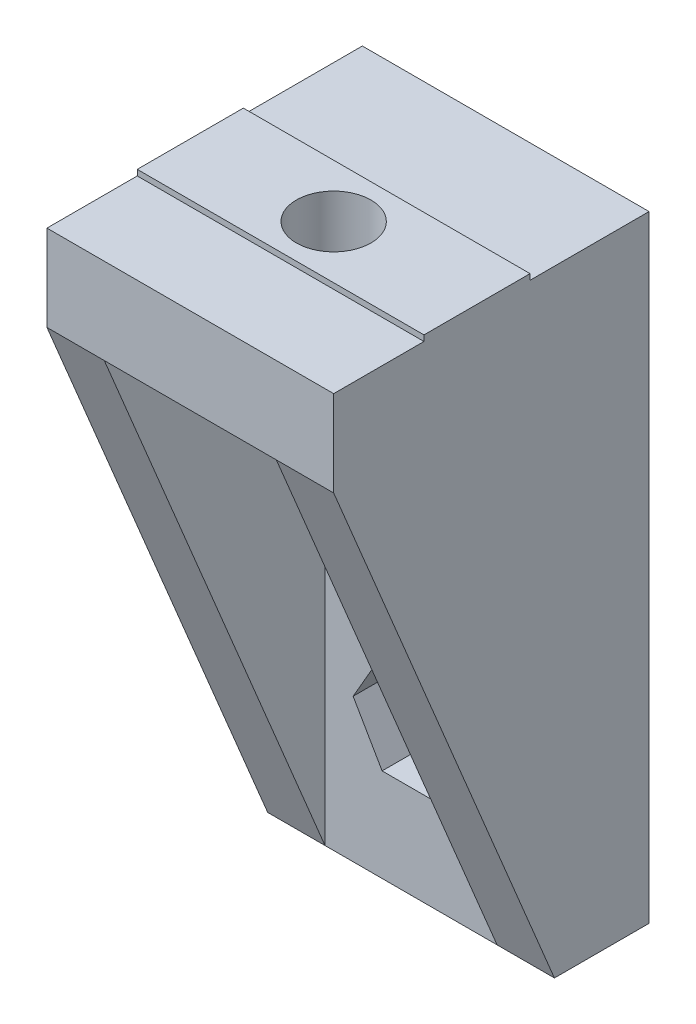
ISO-10303-21;
HEADER;
FILE_DESCRIPTION(('STEP AP214'),'2;1');
FILE_NAME('part.step','',(''),(''),'','','');
FILE_SCHEMA(('AUTOMOTIVE_DESIGN { 1 0 10303 214 1 1 1 1 }'));
ENDSEC;
DATA;
#1=APPLICATION_CONTEXT('core data for automotive mechanical design processes');
#2=APPLICATION_PROTOCOL_DEFINITION('international standard','automotive_design',2000,#1);
#3=PRODUCT_CONTEXT('',#1,'mechanical');
#4=PRODUCT('Part','Part','',(#3));
#5=PRODUCT_RELATED_PRODUCT_CATEGORY('part','',(#4));
#6=PRODUCT_DEFINITION_FORMATION('','',#4);
#7=PRODUCT_DEFINITION_CONTEXT('part definition',#1,'design');
#8=PRODUCT_DEFINITION('design','',#6,#7);
#9=PRODUCT_DEFINITION_SHAPE('','',#8);
#10=(LENGTH_UNIT() NAMED_UNIT(*) SI_UNIT(.MILLI.,.METRE.));
#11=(NAMED_UNIT(*) PLANE_ANGLE_UNIT() SI_UNIT($,.RADIAN.));
#12=(NAMED_UNIT(*) SI_UNIT($,.STERADIAN.) SOLID_ANGLE_UNIT());
#13=UNCERTAINTY_MEASURE_WITH_UNIT(LENGTH_MEASURE(1.E-05),#10,'distance_accuracy_value','');
#14=(GEOMETRIC_REPRESENTATION_CONTEXT(3) GLOBAL_UNCERTAINTY_ASSIGNED_CONTEXT((#13)) GLOBAL_UNIT_ASSIGNED_CONTEXT((#10,
#11,#12)) REPRESENTATION_CONTEXT('',''));
#15=CARTESIAN_POINT('',(0.,0.,0.));
#16=DIRECTION('',(0.,0.,1.));
#17=DIRECTION('',(1.,0.,0.));
#18=AXIS2_PLACEMENT_3D('',#15,#16,#17);
#19=CARTESIAN_POINT('',(0.,0.,6.6));
#20=DIRECTION('',(0.,0.,1.));
#21=DIRECTION('',(1.,0.,0.));
#22=AXIS2_PLACEMENT_3D('',#19,#20,#21);
#23=PLANE('',#22);
#24=DIRECTION('',(0.5,0.866025403784439,0.));
#25=VECTOR('',#24,1.);
#26=CARTESIAN_POINT('',(2.02072594216369,6.5,6.6));
#27=LINE('',#26,#25);
#28=CARTESIAN_POINT('',(2.02072594216369,6.5,6.6));
#29=VERTEX_POINT('',#28);
#30=CARTESIAN_POINT('',(4.04145188432738,10.,6.6));
#31=VERTEX_POINT('',#30);
#32=EDGE_CURVE('E60',#29,#31,#27,.T.);
#33=ORIENTED_EDGE('',*,*,#32,.F.);
#34=DIRECTION('',(1.,0.,0.));
#35=VECTOR('',#34,1.);
#36=CARTESIAN_POINT('',(-2.02072594216368,6.5,6.6));
#37=LINE('',#36,#35);
#38=CARTESIAN_POINT('',(-2.02072594216368,6.5,6.6));
#39=VERTEX_POINT('',#38);
#40=EDGE_CURVE('E288',#39,#29,#37,.T.);
#41=ORIENTED_EDGE('',*,*,#40,.F.);
#42=DIRECTION('',(0.5,-0.866025403784438,0.));
#43=VECTOR('',#42,1.);
#44=CARTESIAN_POINT('',(-4.04145188432738,10.,6.6));
#45=LINE('',#44,#43);
#46=CARTESIAN_POINT('',(-4.04145188432738,10.,6.6));
#47=VERTEX_POINT('',#46);
#48=EDGE_CURVE('E314',#47,#39,#45,.T.);
#49=ORIENTED_EDGE('',*,*,#48,.F.);
#50=DIRECTION('',(-0.5,-0.866025403784439,0.));
#51=VECTOR('',#50,1.);
#52=CARTESIAN_POINT('',(-2.02072594216369,13.5,6.6));
#53=LINE('',#52,#51);
#54=CARTESIAN_POINT('',(-2.02072594216369,13.5,6.6));
#55=VERTEX_POINT('',#54);
#56=EDGE_CURVE('E311',#55,#47,#53,.T.);
#57=ORIENTED_EDGE('',*,*,#56,.F.);
#58=DIRECTION('',(-1.,0.,0.));
#59=VECTOR('',#58,1.);
#60=CARTESIAN_POINT('',(2.02072594216369,13.5,6.6));
#61=LINE('',#60,#59);
#62=CARTESIAN_POINT('',(2.02072594216369,13.5,6.6));
#63=VERTEX_POINT('',#62);
#64=EDGE_CURVE('E308',#63,#55,#61,.T.);
#65=ORIENTED_EDGE('',*,*,#64,.F.);
#66=DIRECTION('',(-0.5,0.866025403784438,0.));
#67=VECTOR('',#66,1.);
#68=CARTESIAN_POINT('',(4.04145188432738,10.,6.6));
#69=LINE('',#68,#67);
#70=EDGE_CURVE('E305',#31,#63,#69,.T.);
#71=ORIENTED_EDGE('',*,*,#70,.F.);
#72=EDGE_LOOP('',(#33,#41,#49,#57,#65,#71));
#73=FACE_BOUND('',#72,.T.);
#74=DIRECTION('',(1.,0.,0.));
#75=VECTOR('',#74,1.);
#76=CARTESIAN_POINT('',(10.,0.,6.6));
#77=LINE('',#76,#75);
#78=CARTESIAN_POINT('',(-6.,0.,6.6));
#79=VERTEX_POINT('',#78);
#80=CARTESIAN_POINT('',(6.,0.,6.6));
#81=VERTEX_POINT('',#80);
#82=EDGE_CURVE('E187',#79,#81,#77,.T.);
#83=ORIENTED_EDGE('',*,*,#82,.T.);
#84=DIRECTION('',(0.,-1.,0.));
#85=VECTOR('',#84,1.);
#86=CARTESIAN_POINT('',(6.00000000000002,37.,6.6));
#87=LINE('',#86,#85);
#88=CARTESIAN_POINT('',(6.00000000000002,37.,6.6));
#89=VERTEX_POINT('',#88);
#90=EDGE_CURVE('E162',#89,#81,#87,.T.);
#91=ORIENTED_EDGE('',*,*,#90,.F.);
#92=DIRECTION('',(-1.,0.,0.));
#93=VECTOR('',#92,1.);
#94=CARTESIAN_POINT('',(10.,37.,6.6));
#95=LINE('',#94,#93);
#96=CARTESIAN_POINT('',(-6.00000000000002,37.,6.6));
#97=VERTEX_POINT('',#96);
#98=EDGE_CURVE('E195',#89,#97,#95,.T.);
#99=ORIENTED_EDGE('',*,*,#98,.T.);
#100=DIRECTION('',(0.,-1.,0.));
#101=VECTOR('',#100,1.);
#102=CARTESIAN_POINT('',(-6.00000000000002,37.,6.6));
#103=LINE('',#102,#101);
#104=EDGE_CURVE('E191',#97,#79,#103,.T.);
#105=ORIENTED_EDGE('',*,*,#104,.T.);
#106=EDGE_LOOP('',(#83,#91,#99,#105));
#107=FACE_BOUND('',#106,.T.);
#108=ADVANCED_FACE('F36',(#73,#107),#23,.T.);
#109=CARTESIAN_POINT('',(0.,37.,0.));
#110=DIRECTION('',(0.,1.,0.));
#111=DIRECTION('',(0.,0.,1.));
#112=AXIS2_PLACEMENT_3D('',#109,#110,#111);
#113=PLANE('',#112);
#114=CARTESIAN_POINT('',(0.,37.,12.));
#115=DIRECTION('',(0.,1.,0.));
#116=DIRECTION('',(0.,0.,1.));
#117=AXIS2_PLACEMENT_3D('',#114,#115,#116);
#118=CIRCLE('',#117,2.6);
#119=CARTESIAN_POINT('',(0.,37.,14.6));
#120=VERTEX_POINT('',#119);
#121=EDGE_CURVE('E239',#120,#120,#118,.T.);
#122=ORIENTED_EDGE('',*,*,#121,.T.);
#123=EDGE_LOOP('',(#122));
#124=FACE_BOUND('',#123,.T.);
#125=DIRECTION('',(0.,0.,-1.));
#126=VECTOR('',#125,1.);
#127=CARTESIAN_POINT('',(6.00000000000002,37.,22.));
#128=LINE('',#127,#126);
#129=CARTESIAN_POINT('',(6.00000000000002,37.,22.));
#130=VERTEX_POINT('',#129);
#131=EDGE_CURVE('E168',#130,#89,#128,.T.);
#132=ORIENTED_EDGE('',*,*,#131,.F.);
#133=DIRECTION('',(1.,0.,0.));
#134=VECTOR('',#133,1.);
#135=CARTESIAN_POINT('',(-10.,37.,22.));
#136=LINE('',#135,#134);
#137=CARTESIAN_POINT('',(-6.00000000000002,37.,22.));
#138=VERTEX_POINT('',#137);
#139=EDGE_CURVE('E260',#138,#130,#136,.T.);
#140=ORIENTED_EDGE('',*,*,#139,.F.);
#141=DIRECTION('',(0.,0.,-1.));
#142=VECTOR('',#141,1.);
#143=CARTESIAN_POINT('',(-6.00000000000002,37.,22.));
#144=LINE('',#143,#142);
#145=EDGE_CURVE('E231',#138,#97,#144,.T.);
#146=ORIENTED_EDGE('',*,*,#145,.T.);
#147=ORIENTED_EDGE('',*,*,#98,.F.);
#148=EDGE_LOOP('',(#132,#140,#146,#147));
#149=FACE_BOUND('',#148,.T.);
#150=ADVANCED_FACE('F363',(#124,#149),#113,.F.);
#151=CARTESIAN_POINT('',(0.,43.,0.));
#152=DIRECTION('',(0.,1.,0.));
#153=DIRECTION('',(0.,0.,1.));
#154=AXIS2_PLACEMENT_3D('',#151,#152,#153);
#155=PLANE('',#154);
#156=DIRECTION('',(0.,0.,1.));
#157=VECTOR('',#156,1.);
#158=CARTESIAN_POINT('',(-10.,43.,0.));
#159=LINE('',#158,#157);
#160=CARTESIAN_POINT('',(-10.,43.,0.));
#161=VERTEX_POINT('',#160);
#162=CARTESIAN_POINT('',(-10.,43.,8.29999999999999));
#163=VERTEX_POINT('',#162);
#164=EDGE_CURVE('E266',#161,#163,#159,.T.);
#165=ORIENTED_EDGE('',*,*,#164,.T.);
#166=DIRECTION('',(1.,0.,0.));
#167=VECTOR('',#166,1.);
#168=CARTESIAN_POINT('',(-10.,43.,8.29999999999999));
#169=LINE('',#168,#167);
#170=CARTESIAN_POINT('',(10.,43.,8.29999999999999));
#171=VERTEX_POINT('',#170);
#172=EDGE_CURVE('E242',#163,#171,#169,.T.);
#173=ORIENTED_EDGE('',*,*,#172,.T.);
#174=DIRECTION('',(0.,0.,-1.));
#175=VECTOR('',#174,1.);
#176=CARTESIAN_POINT('',(10.,43.,0.));
#177=LINE('',#176,#175);
#178=CARTESIAN_POINT('',(10.,43.,0.));
#179=VERTEX_POINT('',#178);
#180=EDGE_CURVE('E272',#171,#179,#177,.T.);
#181=ORIENTED_EDGE('',*,*,#180,.T.);
#182=DIRECTION('',(-1.,0.,0.));
#183=VECTOR('',#182,1.);
#184=CARTESIAN_POINT('',(-10.,43.,0.));
#185=LINE('',#184,#183);
#186=EDGE_CURVE('E215',#179,#161,#185,.T.);
#187=ORIENTED_EDGE('',*,*,#186,.T.);
#188=EDGE_LOOP('',(#165,#173,#181,#187));
#189=FACE_BOUND('',#188,.T.);
#190=ADVANCED_FACE('F368',(#189),#155,.T.);
#191=CARTESIAN_POINT('',(10.,43.,22.));
#192=VERTEX_POINT('',#191);
#193=CARTESIAN_POINT('',(10.,43.,15.7));
#194=VERTEX_POINT('',#193);
#195=EDGE_CURVE('E273',#192,#194,#177,.T.);
#196=ORIENTED_EDGE('',*,*,#195,.T.);
#197=DIRECTION('',(-1.,0.,0.));
#198=VECTOR('',#197,1.);
#199=CARTESIAN_POINT('',(-10.,43.,15.7));
#200=LINE('',#199,#198);
#201=CARTESIAN_POINT('',(-10.,43.,15.7));
#202=VERTEX_POINT('',#201);
#203=EDGE_CURVE('E247',#194,#202,#200,.T.);
#204=ORIENTED_EDGE('',*,*,#203,.T.);
#205=CARTESIAN_POINT('',(-10.,43.,22.));
#206=VERTEX_POINT('',#205);
#207=EDGE_CURVE('E270',#202,#206,#159,.T.);
#208=ORIENTED_EDGE('',*,*,#207,.T.);
#209=DIRECTION('',(1.,0.,0.));
#210=VECTOR('',#209,1.);
#211=CARTESIAN_POINT('',(-10.,43.,22.));
#212=LINE('',#211,#210);
#213=EDGE_CURVE('E269',#206,#192,#212,.T.);
#214=ORIENTED_EDGE('',*,*,#213,.T.);
#215=EDGE_LOOP('',(#196,#204,#208,#214));
#216=FACE_BOUND('',#215,.T.);
#217=ADVANCED_FACE('F387',(#216),#155,.T.);
#218=CARTESIAN_POINT('',(0.,10.,6.6));
#219=DIRECTION('',(0.,0.,-1.));
#220=DIRECTION('',(-1.,0.,0.));
#221=AXIS2_PLACEMENT_3D('',#218,#219,#220);
#222=CYLINDRICAL_SURFACE('',#221,2.2);
#223=CARTESIAN_POINT('',(0.,10.,0.));
#224=DIRECTION('',(0.,0.,-1.));
#225=DIRECTION('',(-1.,0.,0.));
#226=AXIS2_PLACEMENT_3D('',#223,#224,#225);
#227=CIRCLE('',#226,2.2);
#228=CARTESIAN_POINT('',(-2.2,10.,0.));
#229=VERTEX_POINT('',#228);
#230=EDGE_CURVE('E200',#229,#229,#227,.T.);
#231=ORIENTED_EDGE('',*,*,#230,.T.);
#232=EDGE_LOOP('',(#231));
#233=FACE_BOUND('',#232,.T.);
#234=CARTESIAN_POINT('',(0.,10.,3.2));
#235=DIRECTION('',(0.,0.,1.));
#236=DIRECTION('',(1.,0.,0.));
#237=AXIS2_PLACEMENT_3D('',#234,#235,#236);
#238=CIRCLE('',#237,2.2);
#239=CARTESIAN_POINT('',(2.2,10.,3.2));
#240=VERTEX_POINT('',#239);
#241=EDGE_CURVE('E40',#240,#240,#238,.F.);
#242=ORIENTED_EDGE('',*,*,#241,.F.);
#243=EDGE_LOOP('',(#242));
#244=FACE_BOUND('',#243,.T.);
#245=ADVANCED_FACE('F373',(#233,#244),#222,.F.);
#246=CARTESIAN_POINT('',(10.,0.,6.6));
#247=DIRECTION('',(0.,1.,0.));
#248=DIRECTION('',(-1.,0.,0.));
#249=AXIS2_PLACEMENT_3D('',#246,#247,#248);
#250=PLANE('',#249);
#251=DIRECTION('',(1.,0.,0.));
#252=VECTOR('',#251,1.);
#253=CARTESIAN_POINT('',(10.,0.,0.));
#254=LINE('',#253,#252);
#255=CARTESIAN_POINT('',(-10.,0.,0.));
#256=VERTEX_POINT('',#255);
#257=CARTESIAN_POINT('',(10.,0.,0.));
#258=VERTEX_POINT('',#257);
#259=EDGE_CURVE('E203',#256,#258,#254,.T.);
#260=ORIENTED_EDGE('',*,*,#259,.T.);
#261=DIRECTION('',(0.,0.,-1.));
#262=VECTOR('',#261,1.);
#263=CARTESIAN_POINT('',(10.,0.,6.6));
#264=LINE('',#263,#262);
#265=CARTESIAN_POINT('',(10.,0.,6.6));
#266=VERTEX_POINT('',#265);
#267=EDGE_CURVE('E11',#266,#258,#264,.T.);
#268=ORIENTED_EDGE('',*,*,#267,.F.);
#269=DIRECTION('',(1.,0.,0.));
#270=VECTOR('',#269,1.);
#271=CARTESIAN_POINT('',(6.,0.,6.6));
#272=LINE('',#271,#270);
#273=EDGE_CURVE('E176',#81,#266,#272,.T.);
#274=ORIENTED_EDGE('',*,*,#273,.F.);
#275=ORIENTED_EDGE('',*,*,#82,.F.);
#276=CARTESIAN_POINT('',(-10.,0.,6.6));
#277=VERTEX_POINT('',#276);
#278=EDGE_CURVE('E192',#277,#79,#77,.T.);
#279=ORIENTED_EDGE('',*,*,#278,.F.);
#280=DIRECTION('',(0.,0.,-1.));
#281=VECTOR('',#280,1.);
#282=CARTESIAN_POINT('',(-10.,0.,6.6));
#283=LINE('',#282,#281);
#284=EDGE_CURVE('E45',#277,#256,#283,.T.);
#285=ORIENTED_EDGE('',*,*,#284,.T.);
#286=EDGE_LOOP('',(#260,#268,#274,#275,#279,#285));
#287=FACE_BOUND('',#286,.T.);
#288=ADVANCED_FACE('F38',(#287),#250,.F.);
#289=CARTESIAN_POINT('',(10.,0.,6.6));
#290=DIRECTION('',(-1.,0.,0.));
#291=DIRECTION('',(0.,-1.,0.));
#292=AXIS2_PLACEMENT_3D('',#289,#290,#291);
#293=PLANE('',#292);
#294=DIRECTION('',(0.,1.,0.));
#295=VECTOR('',#294,1.);
#296=CARTESIAN_POINT('',(10.,0.,0.));
#297=LINE('',#296,#295);
#298=EDGE_CURVE('E196',#258,#179,#297,.T.);
#299=ORIENTED_EDGE('',*,*,#298,.T.);
#300=ORIENTED_EDGE('',*,*,#180,.F.);
#301=DIRECTION('',(0.,-1.,0.));
#302=VECTOR('',#301,1.);
#303=CARTESIAN_POINT('',(10.,43.4,8.29999999999999));
#304=LINE('',#303,#302);
#305=CARTESIAN_POINT('',(10.,43.4,8.29999999999999));
#306=VERTEX_POINT('',#305);
#307=EDGE_CURVE('E263',#306,#171,#304,.T.);
#308=ORIENTED_EDGE('',*,*,#307,.F.);
#309=DIRECTION('',(0.,0.,1.));
#310=VECTOR('',#309,1.);
#311=CARTESIAN_POINT('',(10.,43.4,15.7));
#312=LINE('',#311,#310);
#313=CARTESIAN_POINT('',(10.,43.4,15.7));
#314=VERTEX_POINT('',#313);
#315=EDGE_CURVE('E250',#306,#314,#312,.T.);
#316=ORIENTED_EDGE('',*,*,#315,.T.);
#317=DIRECTION('',(0.,-1.,0.));
#318=VECTOR('',#317,1.);
#319=CARTESIAN_POINT('',(10.,43.4,15.7));
#320=LINE('',#319,#318);
#321=EDGE_CURVE('E261',#314,#194,#320,.T.);
#322=ORIENTED_EDGE('',*,*,#321,.T.);
#323=ORIENTED_EDGE('',*,*,#195,.F.);
#324=DIRECTION('',(0.,-1.,0.));
#325=VECTOR('',#324,1.);
#326=CARTESIAN_POINT('',(10.,43.,22.));
#327=LINE('',#326,#325);
#328=CARTESIAN_POINT('',(10.,37.,22.));
#329=VERTEX_POINT('',#328);
#330=EDGE_CURVE('E222',#192,#329,#327,.T.);
#331=ORIENTED_EDGE('',*,*,#330,.T.);
#332=DIRECTION('',(0.,0.923224500114245,0.384261008155659));
#333=VECTOR('',#332,1.);
#334=CARTESIAN_POINT('',(10.,0.,6.6));
#335=LINE('',#334,#333);
#336=EDGE_CURVE('E180',#266,#329,#335,.T.);
#337=ORIENTED_EDGE('',*,*,#336,.F.);
#338=ORIENTED_EDGE('',*,*,#267,.T.);
#339=EDGE_LOOP('',(#299,#300,#308,#316,#322,#323,#331,#337,#338));
#340=FACE_BOUND('',#339,.T.);
#341=ADVANCED_FACE('F218',(#340),#293,.F.);
#342=CARTESIAN_POINT('',(-10.,37.,6.6));
#343=DIRECTION('',(1.,0.,0.));
#344=DIRECTION('',(0.,1.,0.));
#345=AXIS2_PLACEMENT_3D('',#342,#343,#344);
#346=PLANE('',#345);
#347=ORIENTED_EDGE('',*,*,#284,.F.);
#348=DIRECTION('',(0.,0.923224500114245,0.384261008155659));
#349=VECTOR('',#348,1.);
#350=CARTESIAN_POINT('',(-10.,0.,6.6));
#351=LINE('',#350,#349);
#352=CARTESIAN_POINT('',(-10.,37.,22.));
#353=VERTEX_POINT('',#352);
#354=EDGE_CURVE('E226',#277,#353,#351,.T.);
#355=ORIENTED_EDGE('',*,*,#354,.T.);
#356=DIRECTION('',(0.,-1.,0.));
#357=VECTOR('',#356,1.);
#358=CARTESIAN_POINT('',(-10.,43.,22.));
#359=LINE('',#358,#357);
#360=EDGE_CURVE('E281',#206,#353,#359,.T.);
#361=ORIENTED_EDGE('',*,*,#360,.F.);
#362=ORIENTED_EDGE('',*,*,#207,.F.);
#363=DIRECTION('',(0.,-1.,0.));
#364=VECTOR('',#363,1.);
#365=CARTESIAN_POINT('',(-10.,43.4,15.7));
#366=LINE('',#365,#364);
#367=CARTESIAN_POINT('',(-10.,43.4,15.7));
#368=VERTEX_POINT('',#367);
#369=EDGE_CURVE('E52',#368,#202,#366,.T.);
#370=ORIENTED_EDGE('',*,*,#369,.F.);
#371=DIRECTION('',(0.,0.,-1.));
#372=VECTOR('',#371,1.);
#373=CARTESIAN_POINT('',(-10.,43.4,15.7));
#374=LINE('',#373,#372);
#375=CARTESIAN_POINT('',(-10.,43.4,8.29999999999999));
#376=VERTEX_POINT('',#375);
#377=EDGE_CURVE('E243',#368,#376,#374,.T.);
#378=ORIENTED_EDGE('',*,*,#377,.T.);
#379=DIRECTION('',(0.,-1.,0.));
#380=VECTOR('',#379,1.);
#381=CARTESIAN_POINT('',(-10.,43.4,8.29999999999999));
#382=LINE('',#381,#380);
#383=EDGE_CURVE('E255',#376,#163,#382,.T.);
#384=ORIENTED_EDGE('',*,*,#383,.T.);
#385=ORIENTED_EDGE('',*,*,#164,.F.);
#386=DIRECTION('',(0.,-1.,0.));
#387=VECTOR('',#386,1.);
#388=CARTESIAN_POINT('',(-10.,37.,0.));
#389=LINE('',#388,#387);
#390=EDGE_CURVE('E193',#161,#256,#389,.T.);
#391=ORIENTED_EDGE('',*,*,#390,.T.);
#392=EDGE_LOOP('',(#347,#355,#361,#362,#370,#378,#384,#385,#391));
#393=FACE_BOUND('',#392,.T.);
#394=ADVANCED_FACE('F377',(#393),#346,.F.);
#395=CARTESIAN_POINT('',(0.,0.,0.));
#396=DIRECTION('',(0.,0.,1.));
#397=DIRECTION('',(1.,0.,0.));
#398=AXIS2_PLACEMENT_3D('',#395,#396,#397);
#399=PLANE('',#398);
#400=ORIENTED_EDGE('',*,*,#230,.F.);
#401=EDGE_LOOP('',(#400));
#402=FACE_BOUND('',#401,.T.);
#403=ORIENTED_EDGE('',*,*,#259,.F.);
#404=ORIENTED_EDGE('',*,*,#390,.F.);
#405=ORIENTED_EDGE('',*,*,#186,.F.);
#406=ORIENTED_EDGE('',*,*,#298,.F.);
#407=EDGE_LOOP('',(#403,#404,#405,#406));
#408=FACE_BOUND('',#407,.T.);
#409=ADVANCED_FACE('F212',(#402,#408),#399,.F.);
#410=CARTESIAN_POINT('',(0.,0.,3.2));
#411=DIRECTION('',(0.,0.,1.));
#412=DIRECTION('',(1.,0.,0.));
#413=AXIS2_PLACEMENT_3D('',#410,#411,#412);
#414=PLANE('',#413);
#415=DIRECTION('',(0.5,0.866025403784439,0.));
#416=VECTOR('',#415,1.);
#417=CARTESIAN_POINT('',(2.02072594216369,6.5,3.2));
#418=LINE('',#417,#416);
#419=CARTESIAN_POINT('',(2.02072594216369,6.5,3.2));
#420=VERTEX_POINT('',#419);
#421=CARTESIAN_POINT('',(4.04145188432738,10.,3.2));
#422=VERTEX_POINT('',#421);
#423=EDGE_CURVE('E284',#420,#422,#418,.T.);
#424=ORIENTED_EDGE('',*,*,#423,.T.);
#425=DIRECTION('',(-0.5,0.866025403784438,0.));
#426=VECTOR('',#425,1.);
#427=CARTESIAN_POINT('',(4.04145188432738,10.,3.2));
#428=LINE('',#427,#426);
#429=CARTESIAN_POINT('',(2.02072594216369,13.5,3.2));
#430=VERTEX_POINT('',#429);
#431=EDGE_CURVE('E287',#422,#430,#428,.T.);
#432=ORIENTED_EDGE('',*,*,#431,.T.);
#433=DIRECTION('',(-1.,0.,0.));
#434=VECTOR('',#433,1.);
#435=CARTESIAN_POINT('',(2.02072594216369,13.5,3.2));
#436=LINE('',#435,#434);
#437=CARTESIAN_POINT('',(-2.02072594216369,13.5,3.2));
#438=VERTEX_POINT('',#437);
#439=EDGE_CURVE('E291',#430,#438,#436,.T.);
#440=ORIENTED_EDGE('',*,*,#439,.T.);
#441=DIRECTION('',(-0.5,-0.866025403784439,0.));
#442=VECTOR('',#441,1.);
#443=CARTESIAN_POINT('',(-2.02072594216369,13.5,3.2));
#444=LINE('',#443,#442);
#445=CARTESIAN_POINT('',(-4.04145188432738,10.,3.2));
#446=VERTEX_POINT('',#445);
#447=EDGE_CURVE('E294',#438,#446,#444,.T.);
#448=ORIENTED_EDGE('',*,*,#447,.T.);
#449=DIRECTION('',(0.5,-0.866025403784438,0.));
#450=VECTOR('',#449,1.);
#451=CARTESIAN_POINT('',(-4.04145188432738,10.,3.2));
#452=LINE('',#451,#450);
#453=CARTESIAN_POINT('',(-2.02072594216368,6.5,3.2));
#454=VERTEX_POINT('',#453);
#455=EDGE_CURVE('E297',#446,#454,#452,.T.);
#456=ORIENTED_EDGE('',*,*,#455,.T.);
#457=DIRECTION('',(1.,0.,0.));
#458=VECTOR('',#457,1.);
#459=CARTESIAN_POINT('',(-2.02072594216368,6.5,3.2));
#460=LINE('',#459,#458);
#461=EDGE_CURVE('E300',#454,#420,#460,.T.);
#462=ORIENTED_EDGE('',*,*,#461,.T.);
#463=EDGE_LOOP('',(#424,#432,#440,#448,#456,#462));
#464=FACE_BOUND('',#463,.T.);
#465=ORIENTED_EDGE('',*,*,#241,.T.);
#466=EDGE_LOOP('',(#465));
#467=FACE_BOUND('',#466,.T.);
#468=ADVANCED_FACE('F343',(#464,#467),#414,.T.);
#469=CARTESIAN_POINT('',(2.02072594216369,6.5,3.2));
#470=DIRECTION('',(0.866025403784439,-0.5,0.));
#471=DIRECTION('',(0.5,0.866025403784439,0.));
#472=AXIS2_PLACEMENT_3D('',#469,#470,#471);
#473=PLANE('',#472);
#474=ORIENTED_EDGE('',*,*,#32,.T.);
#475=DIRECTION('',(0.,0.,1.));
#476=VECTOR('',#475,1.);
#477=CARTESIAN_POINT('',(4.04145188432738,10.,3.2));
#478=LINE('',#477,#476);
#479=EDGE_CURVE('E303',#422,#31,#478,.T.);
#480=ORIENTED_EDGE('',*,*,#479,.F.);
#481=ORIENTED_EDGE('',*,*,#423,.F.);
#482=DIRECTION('',(0.,0.,1.));
#483=VECTOR('',#482,1.);
#484=CARTESIAN_POINT('',(2.02072594216369,6.5,3.2));
#485=LINE('',#484,#483);
#486=EDGE_CURVE('E319',#420,#29,#485,.T.);
#487=ORIENTED_EDGE('',*,*,#486,.T.);
#488=EDGE_LOOP('',(#474,#480,#481,#487));
#489=FACE_BOUND('',#488,.T.);
#490=ADVANCED_FACE('F346',(#489),#473,.F.);
#491=CARTESIAN_POINT('',(-2.02072594216368,6.5,3.2));
#492=DIRECTION('',(0.,-1.,0.));
#493=DIRECTION('',(0.,0.,-1.));
#494=AXIS2_PLACEMENT_3D('',#491,#492,#493);
#495=PLANE('',#494);
#496=ORIENTED_EDGE('',*,*,#40,.T.);
#497=ORIENTED_EDGE('',*,*,#486,.F.);
#498=ORIENTED_EDGE('',*,*,#461,.F.);
#499=DIRECTION('',(0.,0.,1.));
#500=VECTOR('',#499,1.);
#501=CARTESIAN_POINT('',(-2.02072594216368,6.5,3.2));
#502=LINE('',#501,#500);
#503=EDGE_CURVE('E321',#454,#39,#502,.T.);
#504=ORIENTED_EDGE('',*,*,#503,.T.);
#505=EDGE_LOOP('',(#496,#497,#498,#504));
#506=FACE_BOUND('',#505,.T.);
#507=ADVANCED_FACE('F348',(#506),#495,.F.);
#508=CARTESIAN_POINT('',(-4.04145188432738,10.,3.2));
#509=DIRECTION('',(-0.866025403784438,-0.5,0.));
#510=DIRECTION('',(0.5,-0.866025403784439,0.));
#511=AXIS2_PLACEMENT_3D('',#508,#509,#510);
#512=PLANE('',#511);
#513=ORIENTED_EDGE('',*,*,#48,.T.);
#514=ORIENTED_EDGE('',*,*,#503,.F.);
#515=ORIENTED_EDGE('',*,*,#455,.F.);
#516=DIRECTION('',(0.,0.,1.));
#517=VECTOR('',#516,1.);
#518=CARTESIAN_POINT('',(-4.04145188432738,10.,3.2));
#519=LINE('',#518,#517);
#520=EDGE_CURVE('E323',#446,#47,#519,.T.);
#521=ORIENTED_EDGE('',*,*,#520,.T.);
#522=EDGE_LOOP('',(#513,#514,#515,#521));
#523=FACE_BOUND('',#522,.T.);
#524=ADVANCED_FACE('F350',(#523),#512,.F.);
#525=CARTESIAN_POINT('',(-2.02072594216369,13.5,3.2));
#526=DIRECTION('',(-0.866025403784439,0.5,0.));
#527=DIRECTION('',(-0.5,-0.866025403784439,0.));
#528=AXIS2_PLACEMENT_3D('',#525,#526,#527);
#529=PLANE('',#528);
#530=ORIENTED_EDGE('',*,*,#56,.T.);
#531=ORIENTED_EDGE('',*,*,#520,.F.);
#532=ORIENTED_EDGE('',*,*,#447,.F.);
#533=DIRECTION('',(0.,0.,1.));
#534=VECTOR('',#533,1.);
#535=CARTESIAN_POINT('',(-2.02072594216369,13.5,3.2));
#536=LINE('',#535,#534);
#537=EDGE_CURVE('E325',#438,#55,#536,.T.);
#538=ORIENTED_EDGE('',*,*,#537,.T.);
#539=EDGE_LOOP('',(#530,#531,#532,#538));
#540=FACE_BOUND('',#539,.T.);
#541=ADVANCED_FACE('F353',(#540),#529,.F.);
#542=CARTESIAN_POINT('',(2.02072594216369,13.5,3.2));
#543=DIRECTION('',(0.,1.,0.));
#544=DIRECTION('',(-1.,0.,0.));
#545=AXIS2_PLACEMENT_3D('',#542,#543,#544);
#546=PLANE('',#545);
#547=ORIENTED_EDGE('',*,*,#64,.T.);
#548=ORIENTED_EDGE('',*,*,#537,.F.);
#549=ORIENTED_EDGE('',*,*,#439,.F.);
#550=DIRECTION('',(0.,0.,1.));
#551=VECTOR('',#550,1.);
#552=CARTESIAN_POINT('',(2.02072594216369,13.5,3.2));
#553=LINE('',#552,#551);
#554=EDGE_CURVE('E327',#430,#63,#553,.T.);
#555=ORIENTED_EDGE('',*,*,#554,.T.);
#556=EDGE_LOOP('',(#547,#548,#549,#555));
#557=FACE_BOUND('',#556,.T.);
#558=ADVANCED_FACE('F339',(#557),#546,.F.);
#559=CARTESIAN_POINT('',(4.04145188432738,10.,3.2));
#560=DIRECTION('',(0.866025403784438,0.5,0.));
#561=DIRECTION('',(-0.5,0.866025403784439,0.));
#562=AXIS2_PLACEMENT_3D('',#559,#560,#561);
#563=PLANE('',#562);
#564=ORIENTED_EDGE('',*,*,#70,.T.);
#565=ORIENTED_EDGE('',*,*,#554,.F.);
#566=ORIENTED_EDGE('',*,*,#431,.F.);
#567=ORIENTED_EDGE('',*,*,#479,.T.);
#568=EDGE_LOOP('',(#564,#565,#566,#567));
#569=FACE_BOUND('',#568,.T.);
#570=ADVANCED_FACE('F331',(#569),#563,.F.);
#571=CARTESIAN_POINT('',(-10.,43.,22.));
#572=DIRECTION('',(0.,0.,-1.));
#573=DIRECTION('',(-1.,0.,0.));
#574=AXIS2_PLACEMENT_3D('',#571,#572,#573);
#575=PLANE('',#574);
#576=EDGE_CURVE('E277',#353,#138,#136,.T.);
#577=ORIENTED_EDGE('',*,*,#576,.T.);
#578=ORIENTED_EDGE('',*,*,#139,.T.);
#579=DIRECTION('',(1.,0.,0.));
#580=VECTOR('',#579,1.);
#581=CARTESIAN_POINT('',(6.00000000000002,37.,22.));
#582=LINE('',#581,#580);
#583=EDGE_CURVE('E179',#130,#329,#582,.T.);
#584=ORIENTED_EDGE('',*,*,#583,.T.);
#585=ORIENTED_EDGE('',*,*,#330,.F.);
#586=ORIENTED_EDGE('',*,*,#213,.F.);
#587=ORIENTED_EDGE('',*,*,#360,.T.);
#588=EDGE_LOOP('',(#577,#578,#584,#585,#586,#587));
#589=FACE_BOUND('',#588,.T.);
#590=ADVANCED_FACE('F406',(#589),#575,.F.);
#591=CARTESIAN_POINT('',(-10.,43.4,15.7));
#592=DIRECTION('',(0.,0.,1.));
#593=DIRECTION('',(1.,0.,0.));
#594=AXIS2_PLACEMENT_3D('',#591,#592,#593);
#595=PLANE('',#594);
#596=ORIENTED_EDGE('',*,*,#203,.F.);
#597=ORIENTED_EDGE('',*,*,#321,.F.);
#598=DIRECTION('',(-1.,0.,0.));
#599=VECTOR('',#598,1.);
#600=CARTESIAN_POINT('',(-10.,43.4,15.7));
#601=LINE('',#600,#599);
#602=EDGE_CURVE('E253',#314,#368,#601,.T.);
#603=ORIENTED_EDGE('',*,*,#602,.T.);
#604=ORIENTED_EDGE('',*,*,#369,.T.);
#605=EDGE_LOOP('',(#596,#597,#603,#604));
#606=FACE_BOUND('',#605,.T.);
#607=ADVANCED_FACE('F465',(#606),#595,.T.);
#608=CARTESIAN_POINT('',(-10.,43.4,8.29999999999999));
#609=DIRECTION('',(0.,0.,-1.));
#610=DIRECTION('',(-1.,0.,0.));
#611=AXIS2_PLACEMENT_3D('',#608,#609,#610);
#612=PLANE('',#611);
#613=ORIENTED_EDGE('',*,*,#172,.F.);
#614=ORIENTED_EDGE('',*,*,#383,.F.);
#615=DIRECTION('',(1.,0.,0.));
#616=VECTOR('',#615,1.);
#617=CARTESIAN_POINT('',(-10.,43.4,8.29999999999999));
#618=LINE('',#617,#616);
#619=EDGE_CURVE('E246',#376,#306,#618,.T.);
#620=ORIENTED_EDGE('',*,*,#619,.T.);
#621=ORIENTED_EDGE('',*,*,#307,.T.);
#622=EDGE_LOOP('',(#613,#614,#620,#621));
#623=FACE_BOUND('',#622,.T.);
#624=ADVANCED_FACE('F470',(#623),#612,.T.);
#625=CARTESIAN_POINT('',(0.,43.4,0.));
#626=DIRECTION('',(0.,-1.,0.));
#627=DIRECTION('',(0.,0.,-1.));
#628=AXIS2_PLACEMENT_3D('',#625,#626,#627);
#629=PLANE('',#628);
#630=CARTESIAN_POINT('',(0.,43.4,12.));
#631=DIRECTION('',(0.,1.,0.));
#632=DIRECTION('',(0.,0.,1.));
#633=AXIS2_PLACEMENT_3D('',#630,#631,#632);
#634=CIRCLE('',#633,2.6);
#635=CARTESIAN_POINT('',(0.,43.4,14.6));
#636=VERTEX_POINT('',#635);
#637=EDGE_CURVE('E235',#636,#636,#634,.T.);
#638=ORIENTED_EDGE('',*,*,#637,.F.);
#639=EDGE_LOOP('',(#638));
#640=FACE_BOUND('',#639,.T.);
#641=ORIENTED_EDGE('',*,*,#377,.F.);
#642=ORIENTED_EDGE('',*,*,#602,.F.);
#643=ORIENTED_EDGE('',*,*,#315,.F.);
#644=ORIENTED_EDGE('',*,*,#619,.F.);
#645=EDGE_LOOP('',(#641,#642,#643,#644));
#646=FACE_BOUND('',#645,.T.);
#647=ADVANCED_FACE('F480',(#640,#646),#629,.F.);
#648=CARTESIAN_POINT('',(0.,0.,12.));
#649=DIRECTION('',(0.,1.,0.));
#650=DIRECTION('',(0.,0.,1.));
#651=AXIS2_PLACEMENT_3D('',#648,#649,#650);
#652=CYLINDRICAL_SURFACE('',#651,2.6);
#653=ORIENTED_EDGE('',*,*,#637,.T.);
#654=EDGE_LOOP('',(#653));
#655=FACE_BOUND('',#654,.T.);
#656=ORIENTED_EDGE('',*,*,#121,.F.);
#657=EDGE_LOOP('',(#656));
#658=FACE_BOUND('',#657,.T.);
#659=ADVANCED_FACE('F490',(#655,#658),#652,.F.);
#660=CARTESIAN_POINT('',(-6.,0.,6.6));
#661=DIRECTION('',(0.,-0.384261008155659,0.923224500114245));
#662=DIRECTION('',(0.,-0.923224500114245,-0.384261008155659));
#663=AXIS2_PLACEMENT_3D('',#660,#661,#662);
#664=PLANE('',#663);
#665=ORIENTED_EDGE('',*,*,#354,.F.);
#666=ORIENTED_EDGE('',*,*,#278,.T.);
#667=DIRECTION('',(0.,0.923224500114245,0.384261008155659));
#668=VECTOR('',#667,1.);
#669=CARTESIAN_POINT('',(-6.,0.,6.6));
#670=LINE('',#669,#668);
#671=EDGE_CURVE('E228',#79,#138,#670,.T.);
#672=ORIENTED_EDGE('',*,*,#671,.T.);
#673=ORIENTED_EDGE('',*,*,#576,.F.);
#674=EDGE_LOOP('',(#665,#666,#672,#673));
#675=FACE_BOUND('',#674,.T.);
#676=ADVANCED_FACE('F500',(#675),#664,.T.);
#677=CARTESIAN_POINT('',(-6.,0.,0.));
#678=DIRECTION('',(-1.,0.,0.));
#679=DIRECTION('',(0.,-1.,0.));
#680=AXIS2_PLACEMENT_3D('',#677,#678,#679);
#681=PLANE('',#680);
#682=ORIENTED_EDGE('',*,*,#671,.F.);
#683=ORIENTED_EDGE('',*,*,#104,.F.);
#684=ORIENTED_EDGE('',*,*,#145,.F.);
#685=EDGE_LOOP('',(#682,#683,#684));
#686=FACE_BOUND('',#685,.T.);
#687=ADVANCED_FACE('F516',(#686),#681,.F.);
#688=CARTESIAN_POINT('',(6.,0.,6.6));
#689=DIRECTION('',(0.,0.384261008155659,-0.923224500114245));
#690=DIRECTION('',(0.,0.923224500114245,0.384261008155659));
#691=AXIS2_PLACEMENT_3D('',#688,#689,#690);
#692=PLANE('',#691);
#693=ORIENTED_EDGE('',*,*,#336,.T.);
#694=ORIENTED_EDGE('',*,*,#583,.F.);
#695=DIRECTION('',(0.,0.923224500114245,0.384261008155659));
#696=VECTOR('',#695,1.);
#697=CARTESIAN_POINT('',(6.,0.,6.6));
#698=LINE('',#697,#696);
#699=EDGE_CURVE('E165',#81,#130,#698,.T.);
#700=ORIENTED_EDGE('',*,*,#699,.F.);
#701=ORIENTED_EDGE('',*,*,#273,.T.);
#702=EDGE_LOOP('',(#693,#694,#700,#701));
#703=FACE_BOUND('',#702,.T.);
#704=ADVANCED_FACE('F175',(#703),#692,.F.);
#705=CARTESIAN_POINT('',(6.,0.,0.));
#706=DIRECTION('',(1.,0.,0.));
#707=DIRECTION('',(0.,-1.,0.));
#708=AXIS2_PLACEMENT_3D('',#705,#706,#707);
#709=PLANE('',#708);
#710=ORIENTED_EDGE('',*,*,#699,.T.);
#711=ORIENTED_EDGE('',*,*,#131,.T.);
#712=ORIENTED_EDGE('',*,*,#90,.T.);
#713=EDGE_LOOP('',(#710,#711,#712));
#714=FACE_BOUND('',#713,.T.);
#715=ADVANCED_FACE('F164',(#714),#709,.F.);
#716=CLOSED_SHELL('',(#108,#150,#190,#217,#245,#288,#341,#394,#409,#468,#490,#507,#524,#541,
#558,#570,#590,#607,#624,#647,#659,#676,#687,#704,#715));
#717=MANIFOLD_SOLID_BREP('B2',#716);
#718=ADVANCED_BREP_SHAPE_REPRESENTATION('',(#18,#717),#14);
#719=SHAPE_DEFINITION_REPRESENTATION(#9,#718);
ENDSEC;
END-ISO-10303-21;
